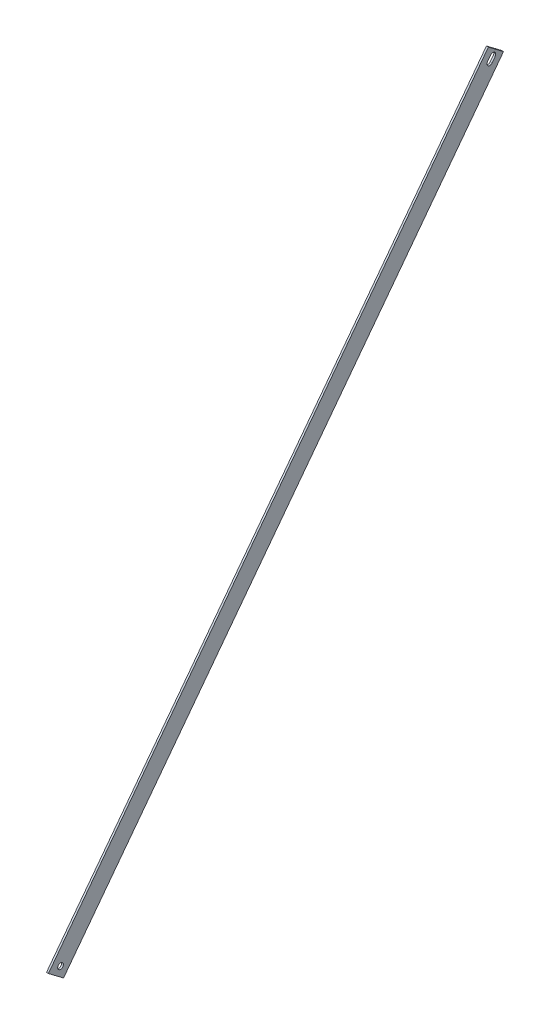
ISO-10303-21;
HEADER;
FILE_DESCRIPTION(('STEP AP214'),'2;1');
FILE_NAME('part.step','',(''),(''),'','','');
FILE_SCHEMA(('AUTOMOTIVE_DESIGN { 1 0 10303 214 1 1 1 1 }'));
ENDSEC;
DATA;
#1=APPLICATION_CONTEXT('core data for automotive mechanical design processes');
#2=APPLICATION_PROTOCOL_DEFINITION('international standard','automotive_design',2000,#1);
#3=PRODUCT_CONTEXT('',#1,'mechanical');
#4=PRODUCT('Part','Part','',(#3));
#5=PRODUCT_RELATED_PRODUCT_CATEGORY('part','',(#4));
#6=PRODUCT_DEFINITION_FORMATION('','',#4);
#7=PRODUCT_DEFINITION_CONTEXT('part definition',#1,'design');
#8=PRODUCT_DEFINITION('design','',#6,#7);
#9=PRODUCT_DEFINITION_SHAPE('','',#8);
#10=(LENGTH_UNIT() NAMED_UNIT(*) SI_UNIT(.MILLI.,.METRE.));
#11=(NAMED_UNIT(*) PLANE_ANGLE_UNIT() SI_UNIT($,.RADIAN.));
#12=(NAMED_UNIT(*) SI_UNIT($,.STERADIAN.) SOLID_ANGLE_UNIT());
#13=UNCERTAINTY_MEASURE_WITH_UNIT(LENGTH_MEASURE(1.E-05),#10,'distance_accuracy_value','');
#14=(GEOMETRIC_REPRESENTATION_CONTEXT(3) GLOBAL_UNCERTAINTY_ASSIGNED_CONTEXT((#13)) GLOBAL_UNIT_ASSIGNED_CONTEXT((#10,
#11,#12)) REPRESENTATION_CONTEXT('',''));
#15=CARTESIAN_POINT('',(0.,0.,0.));
#16=DIRECTION('',(0.,0.,1.));
#17=DIRECTION('',(1.,0.,0.));
#18=AXIS2_PLACEMENT_3D('',#15,#16,#17);
#19=CARTESIAN_POINT('',(3.0031,18.084988450719,718.40400692906));
#20=DIRECTION('',(-1.,0.,0.));
#21=DIRECTION('',(0.,0.,1.));
#22=AXIS2_PLACEMENT_3D('',#19,#20,#21);
#23=PLANE('',#22);
#24=CARTESIAN_POINT('',(3.0031,921.80836929568,16.790667643257));
#25=DIRECTION('',(1.,0.,0.));
#26=DIRECTION('',(0.,0.,-1.));
#27=AXIS2_PLACEMENT_3D('',#24,#25,#26);
#28=CIRCLE('',#27,4.5);
#29=CARTESIAN_POINT('',(3.0031,924.521118197019,20.3810706009075));
#30=VERTEX_POINT('',#29);
#31=CARTESIAN_POINT('',(3.0031,919.095620394345,13.2002646856059));
#32=VERTEX_POINT('',#31);
#33=EDGE_CURVE('E122',#30,#32,#28,.F.);
#34=ORIENTED_EDGE('',*,*,#33,.T.);
#35=DIRECTION('',(0.,0.797867323922004,-0.602833089186003));
#36=VECTOR('',#35,1.);
#37=CARTESIAN_POINT('',(3.0031,912.71268180297,18.022929399093));
#38=LINE('',#37,#36);
#39=CARTESIAN_POINT('',(3.0031,912.712681802971,18.0229293990925));
#40=VERTEX_POINT('',#39);
#41=EDGE_CURVE('E108',#32,#40,#38,.F.);
#42=ORIENTED_EDGE('',*,*,#41,.T.);
#43=CARTESIAN_POINT('',(3.0031,915.42543070431,21.613332356743));
#44=DIRECTION('',(1.,0.,0.));
#45=DIRECTION('',(0.,0.,-1.));
#46=AXIS2_PLACEMENT_3D('',#43,#44,#45);
#47=CIRCLE('',#46,4.5);
#48=CARTESIAN_POINT('',(3.0031,918.138179605645,25.2037353143943));
#49=VERTEX_POINT('',#48);
#50=EDGE_CURVE('E57',#40,#49,#47,.F.);
#51=ORIENTED_EDGE('',*,*,#50,.T.);
#52=DIRECTION('',(0.,-0.797867323922004,0.602833089186003));
#53=VECTOR('',#52,1.);
#54=CARTESIAN_POINT('',(3.0031,924.52111819702,20.381070600907));
#55=LINE('',#54,#53);
#56=EDGE_CURVE('E103',#49,#30,#55,.F.);
#57=ORIENTED_EDGE('',*,*,#56,.T.);
#58=EDGE_LOOP('',(#34,#42,#51,#57));
#59=FACE_BOUND('',#58,.T.);
#60=CARTESIAN_POINT('',(3.0031,18.6169,699.202));
#61=DIRECTION('',(-1.,0.,0.));
#62=DIRECTION('',(0.,0.,1.));
#63=AXIS2_PLACEMENT_3D('',#60,#61,#62);
#64=CIRCLE('',#63,4.5);
#65=CARTESIAN_POINT('',(3.0031,18.6169,703.702));
#66=VERTEX_POINT('',#65);
#67=EDGE_CURVE('E19',#66,#66,#64,.T.);
#68=ORIENTED_EDGE('',*,*,#67,.T.);
#69=EDGE_LOOP('',(#68));
#70=FACE_BOUND('',#69,.T.);
#71=DIRECTION('',(0.,0.602833089186003,0.797867323922004));
#72=VECTOR('',#71,1.);
#73=CARTESIAN_POINT('',(3.0031,937.23380422485,23.936012788605));
#74=LINE('',#73,#72);
#75=CARTESIAN_POINT('',(3.0031,937.233804224715,23.9360127884258));
#76=VERTEX_POINT('',#75);
#77=CARTESIAN_POINT('',(3.0031,919.14881154921,-6.92915022440112E-06));
#78=VERTEX_POINT('',#77);
#79=EDGE_CURVE('E77',#76,#78,#74,.F.);
#80=ORIENTED_EDGE('',*,*,#79,.F.);
#81=DIRECTION('',(0.,0.797867323922004,-0.602833089186003));
#82=VECTOR('',#81,1.);
#83=CARTESIAN_POINT('',(3.0031,18.084988450719,718.40400692906));
#84=LINE('',#83,#82);
#85=CARTESIAN_POINT('',(3.0031,18.084988450719,718.40400692906));
#86=VERTEX_POINT('',#85);
#87=EDGE_CURVE('E75',#76,#86,#84,.F.);
#88=ORIENTED_EDGE('',*,*,#87,.T.);
#89=DIRECTION('',(0.,0.602833089186003,0.797867323922004));
#90=VECTOR('',#89,1.);
#91=CARTESIAN_POINT('',(3.0031,18.084988450719,718.40400692906));
#92=LINE('',#91,#90);
#93=CARTESIAN_POINT('',(3.0031,-4.22485477175861E-06,694.467987211392));
#94=VERTEX_POINT('',#93);
#95=EDGE_CURVE('E66',#86,#94,#92,.F.);
#96=ORIENTED_EDGE('',*,*,#95,.T.);
#97=DIRECTION('',(0.,0.797867323922004,-0.602833089186003));
#98=VECTOR('',#97,1.);
#99=CARTESIAN_POINT('',(3.0031,-4.224852233392E-06,694.46798721139));
#100=LINE('',#99,#98);
#101=EDGE_CURVE('E135',#78,#94,#100,.F.);
#102=ORIENTED_EDGE('',*,*,#101,.F.);
#103=EDGE_LOOP('',(#80,#88,#96,#102));
#104=FACE_BOUND('',#103,.T.);
#105=ADVANCED_FACE('F16',(#59,#70,#104),#23,.F.);
#106=CARTESIAN_POINT('',(3.0031,18.084988450719,718.40400692906));
#107=DIRECTION('',(0.,0.797867323922004,-0.602833089186003));
#108=DIRECTION('',(0.,0.602833089186003,0.797867323922004));
#109=AXIS2_PLACEMENT_3D('',#106,#107,#108);
#110=PLANE('',#109);
#111=DIRECTION('',(1.,0.,0.));
#112=VECTOR('',#111,1.);
#113=CARTESIAN_POINT('',(3.0031,-4.22485222808282E-06,694.46798721139));
#114=LINE('',#113,#112);
#115=CARTESIAN_POINT('',(0.00309999999998951,-4.2248573903074E-06,694.467987211394));
#116=VERTEX_POINT('',#115);
#117=EDGE_CURVE('E91',#94,#116,#114,.F.);
#118=ORIENTED_EDGE('',*,*,#117,.F.);
#119=ORIENTED_EDGE('',*,*,#95,.F.);
#120=DIRECTION('',(1.,0.,0.));
#121=VECTOR('',#120,1.);
#122=CARTESIAN_POINT('',(3.0031,18.084988450719,718.40400692906));
#123=LINE('',#122,#121);
#124=CARTESIAN_POINT('',(0.00309999999998951,18.084988450719,718.40400692906));
#125=VERTEX_POINT('',#124);
#126=EDGE_CURVE('E82',#86,#125,#123,.F.);
#127=ORIENTED_EDGE('',*,*,#126,.T.);
#128=DIRECTION('',(0.,0.602833089185658,0.797867323922265));
#129=VECTOR('',#128,1.);
#130=CARTESIAN_POINT('',(0.003099999999904,-4.22485222154045E-06,694.46798721139));
#131=LINE('',#130,#129);
#132=EDGE_CURVE('E106',#116,#125,#131,.T.);
#133=ORIENTED_EDGE('',*,*,#132,.F.);
#134=EDGE_LOOP('',(#118,#119,#127,#133));
#135=FACE_BOUND('',#134,.T.);
#136=ADVANCED_FACE('F86',(#135),#110,.F.);
#137=CARTESIAN_POINT('',(3.0031,18.084988450719,718.40400692906));
#138=DIRECTION('',(0.,-0.602833089186003,-0.797867323922004));
#139=DIRECTION('',(0.,0.797867323922004,-0.602833089186003));
#140=AXIS2_PLACEMENT_3D('',#137,#138,#139);
#141=PLANE('',#140);
#142=DIRECTION('',(0.,0.797867323922239,-0.602833089185692));
#143=VECTOR('',#142,1.);
#144=CARTESIAN_POINT('',(0.003099999999904,18.084988450719,718.40400692906));
#145=LINE('',#144,#143);
#146=CARTESIAN_POINT('',(0.00309999999998951,937.233804224715,23.9360127884258));
#147=VERTEX_POINT('',#146);
#148=EDGE_CURVE('E96',#125,#147,#145,.T.);
#149=ORIENTED_EDGE('',*,*,#148,.F.);
#150=ORIENTED_EDGE('',*,*,#126,.F.);
#151=ORIENTED_EDGE('',*,*,#87,.F.);
#152=DIRECTION('',(1.,0.,0.));
#153=VECTOR('',#152,1.);
#154=CARTESIAN_POINT('',(3.0031,937.23380422485,23.936012788605));
#155=LINE('',#154,#153);
#156=EDGE_CURVE('E98',#147,#76,#155,.T.);
#157=ORIENTED_EDGE('',*,*,#156,.F.);
#158=EDGE_LOOP('',(#149,#150,#151,#157));
#159=FACE_BOUND('',#158,.T.);
#160=ADVANCED_FACE('F94',(#159),#141,.F.);
#161=CARTESIAN_POINT('',(3.0031,937.23380422485,23.936012788605));
#162=DIRECTION('',(0.,0.797867323922004,-0.602833089186003));
#163=DIRECTION('',(0.,0.602833089186003,0.797867323922004));
#164=AXIS2_PLACEMENT_3D('',#161,#162,#163);
#165=PLANE('',#164);
#166=DIRECTION('',(1.,0.,0.));
#167=VECTOR('',#166,1.);
#168=CARTESIAN_POINT('',(3.0031,919.148811549008,-6.92942281332876E-06));
#169=LINE('',#168,#167);
#170=CARTESIAN_POINT('',(0.00309999999998951,919.148811549207,-6.92914840321754E-06));
#171=VERTEX_POINT('',#170);
#172=EDGE_CURVE('E127',#171,#78,#169,.T.);
#173=ORIENTED_EDGE('',*,*,#172,.F.);
#174=DIRECTION('',(0.,-0.602833089185681,-0.797867323922247));
#175=VECTOR('',#174,1.);
#176=CARTESIAN_POINT('',(0.003099999999904,937.23380422485,23.936012788605));
#177=LINE('',#176,#175);
#178=EDGE_CURVE('E144',#147,#171,#177,.T.);
#179=ORIENTED_EDGE('',*,*,#178,.F.);
#180=ORIENTED_EDGE('',*,*,#156,.T.);
#181=ORIENTED_EDGE('',*,*,#79,.T.);
#182=EDGE_LOOP('',(#173,#179,#180,#181));
#183=FACE_BOUND('',#182,.T.);
#184=ADVANCED_FACE('F140',(#183),#165,.T.);
#185=CARTESIAN_POINT('',(3.0031,-4.224852233392E-06,694.46798721139));
#186=DIRECTION('',(0.,-0.602833089186003,-0.797867323922004));
#187=DIRECTION('',(0.,0.797867323922004,-0.602833089186003));
#188=AXIS2_PLACEMENT_3D('',#185,#186,#187);
#189=PLANE('',#188);
#190=DIRECTION('',(0.,-0.797867323922241,0.60283308918569));
#191=VECTOR('',#190,1.);
#192=CARTESIAN_POINT('',(0.003099999999904,919.14881154928,-6.92906176880115E-06));
#193=LINE('',#192,#191);
#194=EDGE_CURVE('E121',#171,#116,#193,.T.);
#195=ORIENTED_EDGE('',*,*,#194,.F.);
#196=ORIENTED_EDGE('',*,*,#172,.T.);
#197=ORIENTED_EDGE('',*,*,#101,.T.);
#198=ORIENTED_EDGE('',*,*,#117,.T.);
#199=EDGE_LOOP('',(#195,#196,#197,#198));
#200=FACE_BOUND('',#199,.T.);
#201=ADVANCED_FACE('F152',(#200),#189,.T.);
#202=CARTESIAN_POINT('',(3.0031,18.6169,699.202));
#203=DIRECTION('',(-1.,0.,0.));
#204=DIRECTION('',(0.,0.,1.));
#205=AXIS2_PLACEMENT_3D('',#202,#203,#204);
#206=CYLINDRICAL_SURFACE('',#205,4.5);
#207=ORIENTED_EDGE('',*,*,#67,.F.);
#208=EDGE_LOOP('',(#207));
#209=FACE_BOUND('',#208,.T.);
#210=CARTESIAN_POINT('',(0.00310000000001802,18.6169,699.202));
#211=DIRECTION('',(-1.,0.,0.));
#212=DIRECTION('',(0.,0.,1.));
#213=AXIS2_PLACEMENT_3D('',#210,#211,#212);
#214=CIRCLE('',#213,4.5);
#215=CARTESIAN_POINT('',(0.00310000000001802,18.6169,703.702));
#216=VERTEX_POINT('',#215);
#217=EDGE_CURVE('E118',#216,#216,#214,.F.);
#218=ORIENTED_EDGE('',*,*,#217,.F.);
#219=EDGE_LOOP('',(#218));
#220=FACE_BOUND('',#219,.T.);
#221=ADVANCED_FACE('F192',(#209,#220),#206,.F.);
#222=CARTESIAN_POINT('',(3.0031,915.42543070431,21.613332356743));
#223=DIRECTION('',(1.,0.,0.));
#224=DIRECTION('',(0.,0.,-1.));
#225=AXIS2_PLACEMENT_3D('',#222,#223,#224);
#226=CYLINDRICAL_SURFACE('',#225,4.5);
#227=DIRECTION('',(1.,0.,0.));
#228=VECTOR('',#227,1.);
#229=CARTESIAN_POINT('',(3.0031,912.71268180297,18.022929399093));
#230=LINE('',#229,#228);
#231=CARTESIAN_POINT('',(0.00309999999996078,912.712681802972,18.0229293990918));
#232=VERTEX_POINT('',#231);
#233=EDGE_CURVE('E111',#40,#232,#230,.F.);
#234=ORIENTED_EDGE('',*,*,#233,.T.);
#235=CARTESIAN_POINT('',(0.00310000000001802,915.42543070431,21.613332356743));
#236=DIRECTION('',(1.,0.,0.));
#237=DIRECTION('',(0.,0.,-1.));
#238=AXIS2_PLACEMENT_3D('',#235,#236,#237);
#239=CIRCLE('',#238,4.5);
#240=CARTESIAN_POINT('',(0.00310000000001802,918.138179605643,25.2037353143934));
#241=VERTEX_POINT('',#240);
#242=EDGE_CURVE('E115',#241,#232,#239,.T.);
#243=ORIENTED_EDGE('',*,*,#242,.F.);
#244=DIRECTION('',(1.,0.,0.));
#245=VECTOR('',#244,1.);
#246=CARTESIAN_POINT('',(3.0031,918.138179605642,25.2037353143962));
#247=LINE('',#246,#245);
#248=EDGE_CURVE('E107',#241,#49,#247,.T.);
#249=ORIENTED_EDGE('',*,*,#248,.T.);
#250=ORIENTED_EDGE('',*,*,#50,.F.);
#251=EDGE_LOOP('',(#234,#243,#249,#250));
#252=FACE_BOUND('',#251,.T.);
#253=ADVANCED_FACE('F170',(#252),#226,.F.);
#254=CARTESIAN_POINT('',(3.0031,912.71268180297,18.022929399093));
#255=DIRECTION('',(0.,-0.602833089186003,-0.797867323922004));
#256=DIRECTION('',(0.,0.797867323922004,-0.602833089186003));
#257=AXIS2_PLACEMENT_3D('',#254,#255,#256);
#258=PLANE('',#257);
#259=DIRECTION('',(1.,0.,0.));
#260=VECTOR('',#259,1.);
#261=CARTESIAN_POINT('',(3.0031,919.095620394348,13.2002646856043));
#262=LINE('',#261,#260);
#263=CARTESIAN_POINT('',(0.00310000000001802,919.095620394347,13.2002646856068));
#264=VERTEX_POINT('',#263);
#265=EDGE_CURVE('E110',#32,#264,#262,.F.);
#266=ORIENTED_EDGE('',*,*,#265,.T.);
#267=DIRECTION('',(0.,0.797867323922302,-0.602833089185608));
#268=VECTOR('',#267,1.);
#269=CARTESIAN_POINT('',(0.003099999999904,912.71268180297,18.022929399093));
#270=LINE('',#269,#268);
#271=EDGE_CURVE('E114',#232,#264,#270,.T.);
#272=ORIENTED_EDGE('',*,*,#271,.F.);
#273=ORIENTED_EDGE('',*,*,#233,.F.);
#274=ORIENTED_EDGE('',*,*,#41,.F.);
#275=EDGE_LOOP('',(#266,#272,#273,#274));
#276=FACE_BOUND('',#275,.T.);
#277=ADVANCED_FACE('F163',(#276),#258,.F.);
#278=CARTESIAN_POINT('',(3.0031,921.80836929568,16.790667643257));
#279=DIRECTION('',(1.,0.,0.));
#280=DIRECTION('',(0.,0.,-1.));
#281=AXIS2_PLACEMENT_3D('',#278,#279,#280);
#282=CYLINDRICAL_SURFACE('',#281,4.5);
#283=DIRECTION('',(1.,0.,0.));
#284=VECTOR('',#283,1.);
#285=CARTESIAN_POINT('',(3.0031,924.52111819702,20.381070600907));
#286=LINE('',#285,#284);
#287=CARTESIAN_POINT('',(0.003099999999961,924.521118197018,20.3810706009082));
#288=VERTEX_POINT('',#287);
#289=EDGE_CURVE('E34',#30,#288,#286,.F.);
#290=ORIENTED_EDGE('',*,*,#289,.T.);
#291=CARTESIAN_POINT('',(0.00310000000001802,921.80836929568,16.790667643257));
#292=DIRECTION('',(1.,0.,0.));
#293=DIRECTION('',(0.,0.,-1.));
#294=AXIS2_PLACEMENT_3D('',#291,#292,#293);
#295=CIRCLE('',#294,4.5);
#296=EDGE_CURVE('E25',#264,#288,#295,.T.);
#297=ORIENTED_EDGE('',*,*,#296,.F.);
#298=ORIENTED_EDGE('',*,*,#265,.F.);
#299=ORIENTED_EDGE('',*,*,#33,.F.);
#300=EDGE_LOOP('',(#290,#297,#298,#299));
#301=FACE_BOUND('',#300,.T.);
#302=ADVANCED_FACE('F166',(#301),#282,.F.);
#303=CARTESIAN_POINT('',(3.0031,924.52111819702,20.381070600907));
#304=DIRECTION('',(0.,0.602833089186003,0.797867323922004));
#305=DIRECTION('',(0.,-0.797867323922004,0.602833089186003));
#306=AXIS2_PLACEMENT_3D('',#303,#304,#305);
#307=PLANE('',#306);
#308=ORIENTED_EDGE('',*,*,#248,.F.);
#309=DIRECTION('',(0.,-0.797867323922307,0.602833089185602));
#310=VECTOR('',#309,1.);
#311=CARTESIAN_POINT('',(0.003099999999904,924.52111819702,20.381070600907));
#312=LINE('',#311,#310);
#313=EDGE_CURVE('E11',#288,#241,#312,.T.);
#314=ORIENTED_EDGE('',*,*,#313,.F.);
#315=ORIENTED_EDGE('',*,*,#289,.F.);
#316=ORIENTED_EDGE('',*,*,#56,.F.);
#317=EDGE_LOOP('',(#308,#314,#315,#316));
#318=FACE_BOUND('',#317,.T.);
#319=ADVANCED_FACE('F173',(#318),#307,.F.);
#320=CARTESIAN_POINT('',(0.003099999999904,18.084988450719,718.40400692906));
#321=DIRECTION('',(-1.,0.,0.));
#322=DIRECTION('',(0.,0.,1.));
#323=AXIS2_PLACEMENT_3D('',#320,#321,#322);
#324=PLANE('',#323);
#325=ORIENTED_EDGE('',*,*,#296,.T.);
#326=ORIENTED_EDGE('',*,*,#313,.T.);
#327=ORIENTED_EDGE('',*,*,#242,.T.);
#328=ORIENTED_EDGE('',*,*,#271,.T.);
#329=EDGE_LOOP('',(#325,#326,#327,#328));
#330=FACE_BOUND('',#329,.T.);
#331=ORIENTED_EDGE('',*,*,#217,.T.);
#332=EDGE_LOOP('',(#331));
#333=FACE_BOUND('',#332,.T.);
#334=ORIENTED_EDGE('',*,*,#178,.T.);
#335=ORIENTED_EDGE('',*,*,#194,.T.);
#336=ORIENTED_EDGE('',*,*,#132,.T.);
#337=ORIENTED_EDGE('',*,*,#148,.T.);
#338=EDGE_LOOP('',(#334,#335,#336,#337));
#339=FACE_BOUND('',#338,.T.);
#340=ADVANCED_FACE('F153',(#330,#333,#339),#324,.T.);
#341=CLOSED_SHELL('',(#105,#136,#160,#184,#201,#221,#253,#277,#302,#319,#340));
#342=MANIFOLD_SOLID_BREP('B1',#341);
#343=ADVANCED_BREP_SHAPE_REPRESENTATION('',(#18,#342),#14);
#344=SHAPE_DEFINITION_REPRESENTATION(#9,#343);
ENDSEC;
END-ISO-10303-21;
